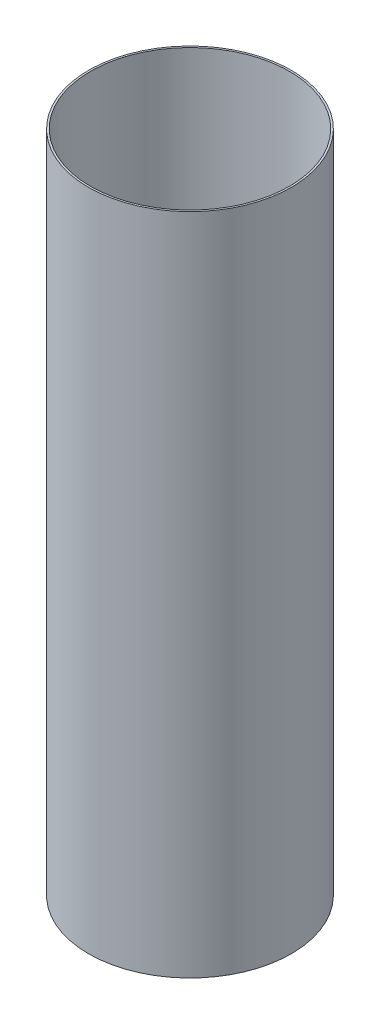
ISO-10303-21;
HEADER;
FILE_DESCRIPTION(('STEP AP214'),'2;1');
FILE_NAME('part.step','',(''),(''),'','','');
FILE_SCHEMA(('AUTOMOTIVE_DESIGN { 1 0 10303 214 1 1 1 1 }'));
ENDSEC;
DATA;
#1=APPLICATION_CONTEXT('core data for automotive mechanical design processes');
#2=APPLICATION_PROTOCOL_DEFINITION('international standard','automotive_design',2000,#1);
#3=PRODUCT_CONTEXT('',#1,'mechanical');
#4=PRODUCT('Part','Part','',(#3));
#5=PRODUCT_RELATED_PRODUCT_CATEGORY('part','',(#4));
#6=PRODUCT_DEFINITION_FORMATION('','',#4);
#7=PRODUCT_DEFINITION_CONTEXT('part definition',#1,'design');
#8=PRODUCT_DEFINITION('design','',#6,#7);
#9=PRODUCT_DEFINITION_SHAPE('','',#8);
#10=(LENGTH_UNIT() NAMED_UNIT(*) SI_UNIT(.MILLI.,.METRE.));
#11=(NAMED_UNIT(*) PLANE_ANGLE_UNIT() SI_UNIT($,.RADIAN.));
#12=(NAMED_UNIT(*) SI_UNIT($,.STERADIAN.) SOLID_ANGLE_UNIT());
#13=UNCERTAINTY_MEASURE_WITH_UNIT(LENGTH_MEASURE(1.E-05),#10,'distance_accuracy_value','');
#14=(GEOMETRIC_REPRESENTATION_CONTEXT(3) GLOBAL_UNCERTAINTY_ASSIGNED_CONTEXT((#13)) GLOBAL_UNIT_ASSIGNED_CONTEXT((#10,
#11,#12)) REPRESENTATION_CONTEXT('',''));
#15=CARTESIAN_POINT('',(0.,0.,0.));
#16=DIRECTION('',(0.,0.,1.));
#17=DIRECTION('',(1.,0.,0.));
#18=AXIS2_PLACEMENT_3D('',#15,#16,#17);
#19=CARTESIAN_POINT('',(0.,254.,0.));
#20=DIRECTION('',(0.,1.,0.));
#21=DIRECTION('',(0.,0.,1.));
#22=AXIS2_PLACEMENT_3D('',#19,#20,#21);
#23=PLANE('',#22);
#24=CARTESIAN_POINT('',(0.,254.,0.));
#25=DIRECTION('',(0.,1.,0.));
#26=DIRECTION('',(0.,0.,1.));
#27=AXIS2_PLACEMENT_3D('',#24,#25,#26);
#28=CIRCLE('',#27,77.6224);
#29=CARTESIAN_POINT('',(0.,254.,77.6224));
#30=VERTEX_POINT('',#29);
#31=EDGE_CURVE('E10',#30,#30,#28,.T.);
#32=ORIENTED_EDGE('',*,*,#31,.T.);
#33=EDGE_LOOP('',(#32));
#34=FACE_BOUND('',#33,.T.);
#35=CARTESIAN_POINT('',(0.,254.,0.));
#36=DIRECTION('',(0.,1.,0.));
#37=DIRECTION('',(0.,0.,1.));
#38=AXIS2_PLACEMENT_3D('',#35,#36,#37);
#39=CIRCLE('',#38,76.2);
#40=CARTESIAN_POINT('',(0.,254.,76.2));
#41=VERTEX_POINT('',#40);
#42=EDGE_CURVE('E51',#41,#41,#39,.T.);
#43=ORIENTED_EDGE('',*,*,#42,.F.);
#44=EDGE_LOOP('',(#43));
#45=FACE_BOUND('',#44,.T.);
#46=ADVANCED_FACE('F37',(#34,#45),#23,.T.);
#47=CARTESIAN_POINT('',(0.,-254.,0.));
#48=DIRECTION('',(0.,1.,0.));
#49=DIRECTION('',(0.,0.,1.));
#50=AXIS2_PLACEMENT_3D('',#47,#48,#49);
#51=PLANE('',#50);
#52=CARTESIAN_POINT('',(0.,-254.,0.));
#53=DIRECTION('',(0.,1.,0.));
#54=DIRECTION('',(0.,0.,1.));
#55=AXIS2_PLACEMENT_3D('',#52,#53,#54);
#56=CIRCLE('',#55,77.6224);
#57=CARTESIAN_POINT('',(0.,-254.,77.6224));
#58=VERTEX_POINT('',#57);
#59=EDGE_CURVE('E41',#58,#58,#56,.T.);
#60=ORIENTED_EDGE('',*,*,#59,.F.);
#61=EDGE_LOOP('',(#60));
#62=FACE_BOUND('',#61,.T.);
#63=CARTESIAN_POINT('',(0.,-254.,0.));
#64=DIRECTION('',(0.,1.,0.));
#65=DIRECTION('',(0.,0.,1.));
#66=AXIS2_PLACEMENT_3D('',#63,#64,#65);
#67=CIRCLE('',#66,76.2);
#68=CARTESIAN_POINT('',(0.,-254.,76.2));
#69=VERTEX_POINT('',#68);
#70=EDGE_CURVE('E53',#69,#69,#67,.T.);
#71=ORIENTED_EDGE('',*,*,#70,.T.);
#72=EDGE_LOOP('',(#71));
#73=FACE_BOUND('',#72,.T.);
#74=ADVANCED_FACE('F66',(#62,#73),#51,.F.);
#75=CARTESIAN_POINT('',(0.,254.,0.));
#76=DIRECTION('',(0.,-1.,0.));
#77=DIRECTION('',(0.,0.,-1.));
#78=AXIS2_PLACEMENT_3D('',#75,#76,#77);
#79=CYLINDRICAL_SURFACE('',#78,77.6224);
#80=ORIENTED_EDGE('',*,*,#31,.F.);
#81=EDGE_LOOP('',(#80));
#82=FACE_BOUND('',#81,.T.);
#83=ORIENTED_EDGE('',*,*,#59,.T.);
#84=EDGE_LOOP('',(#83));
#85=FACE_BOUND('',#84,.T.);
#86=ADVANCED_FACE('F39',(#82,#85),#79,.T.);
#87=CARTESIAN_POINT('',(0.,254.,0.));
#88=DIRECTION('',(0.,-1.,0.));
#89=DIRECTION('',(0.,0.,-1.));
#90=AXIS2_PLACEMENT_3D('',#87,#88,#89);
#91=CYLINDRICAL_SURFACE('',#90,76.2);
#92=ORIENTED_EDGE('',*,*,#42,.T.);
#93=EDGE_LOOP('',(#92));
#94=FACE_BOUND('',#93,.T.);
#95=ORIENTED_EDGE('',*,*,#70,.F.);
#96=EDGE_LOOP('',(#95));
#97=FACE_BOUND('',#96,.T.);
#98=ADVANCED_FACE('F62',(#94,#97),#91,.F.);
#99=CLOSED_SHELL('',(#46,#74,#86,#98));
#100=MANIFOLD_SOLID_BREP('B2',#99);
#101=ADVANCED_BREP_SHAPE_REPRESENTATION('',(#18,#100),#14);
#102=SHAPE_DEFINITION_REPRESENTATION(#9,#101);
ENDSEC;
END-ISO-10303-21;
